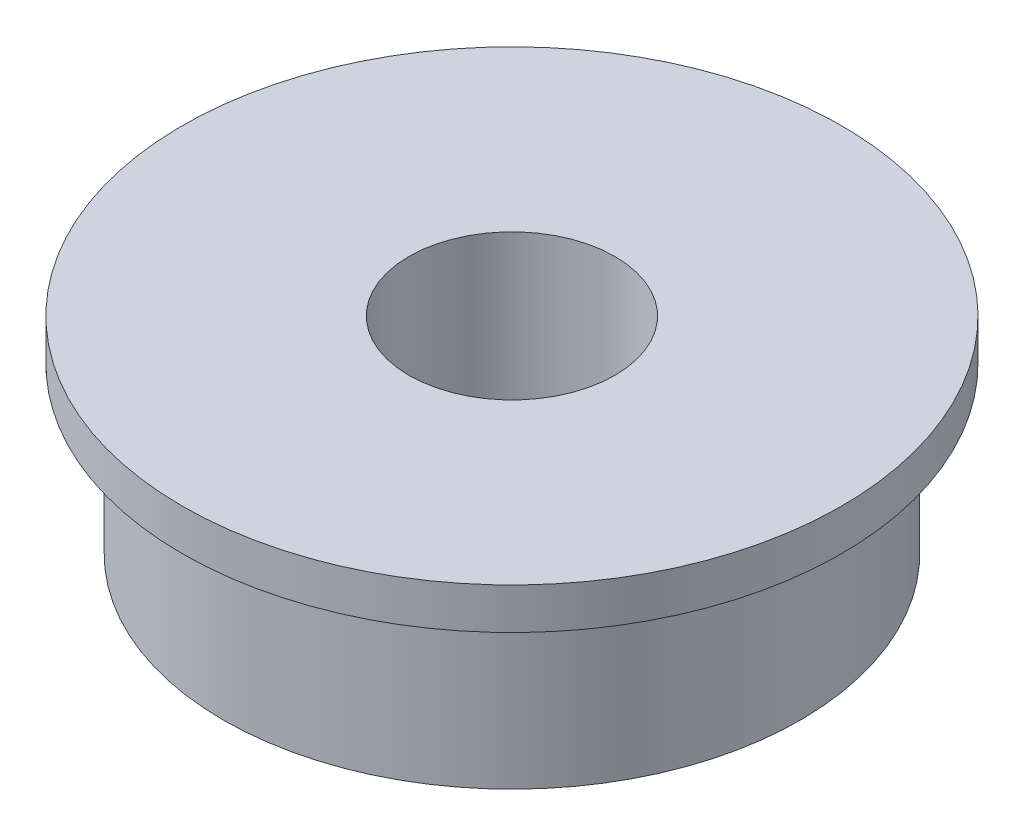
ISO-10303-21;
HEADER;
FILE_DESCRIPTION(('STEP AP214'),'2;1');
FILE_NAME('part.step','',(''),(''),'','','');
FILE_SCHEMA(('AUTOMOTIVE_DESIGN { 1 0 10303 214 1 1 1 1 }'));
ENDSEC;
DATA;
#1=APPLICATION_CONTEXT('core data for automotive mechanical design processes');
#2=APPLICATION_PROTOCOL_DEFINITION('international standard','automotive_design',2000,#1);
#3=PRODUCT_CONTEXT('',#1,'mechanical');
#4=PRODUCT('Part','Part','',(#3));
#5=PRODUCT_RELATED_PRODUCT_CATEGORY('part','',(#4));
#6=PRODUCT_DEFINITION_FORMATION('','',#4);
#7=PRODUCT_DEFINITION_CONTEXT('part definition',#1,'design');
#8=PRODUCT_DEFINITION('design','',#6,#7);
#9=PRODUCT_DEFINITION_SHAPE('','',#8);
#10=(LENGTH_UNIT() NAMED_UNIT(*) SI_UNIT(.MILLI.,.METRE.));
#11=(NAMED_UNIT(*) PLANE_ANGLE_UNIT() SI_UNIT($,.RADIAN.));
#12=(NAMED_UNIT(*) SI_UNIT($,.STERADIAN.) SOLID_ANGLE_UNIT());
#13=UNCERTAINTY_MEASURE_WITH_UNIT(LENGTH_MEASURE(1.E-05),#10,'distance_accuracy_value','');
#14=(GEOMETRIC_REPRESENTATION_CONTEXT(3) GLOBAL_UNCERTAINTY_ASSIGNED_CONTEXT((#13)) GLOBAL_UNIT_ASSIGNED_CONTEXT((#10,
#11,#12)) REPRESENTATION_CONTEXT('',''));
#15=CARTESIAN_POINT('',(0.,0.,0.));
#16=DIRECTION('',(0.,0.,1.));
#17=DIRECTION('',(1.,0.,0.));
#18=AXIS2_PLACEMENT_3D('',#15,#16,#17);
#19=CARTESIAN_POINT('',(0.,5.,0.));
#20=DIRECTION('',(0.,-1.,0.));
#21=DIRECTION('',(0.,0.,-1.));
#22=AXIS2_PLACEMENT_3D('',#19,#20,#21);
#23=CYLINDRICAL_SURFACE('',#22,7.);
#24=CARTESIAN_POINT('',(0.,0.,0.));
#25=DIRECTION('',(0.,1.,0.));
#26=DIRECTION('',(0.,0.,1.));
#27=AXIS2_PLACEMENT_3D('',#24,#25,#26);
#28=CIRCLE('',#27,7.);
#29=CARTESIAN_POINT('',(0.,0.,7.));
#30=VERTEX_POINT('',#29);
#31=EDGE_CURVE('E40',#30,#30,#28,.T.);
#32=ORIENTED_EDGE('',*,*,#31,.T.);
#33=EDGE_LOOP('',(#32));
#34=FACE_BOUND('',#33,.T.);
#35=CARTESIAN_POINT('',(0.,4.,0.));
#36=DIRECTION('',(0.,1.,0.));
#37=DIRECTION('',(0.,0.,1.));
#38=AXIS2_PLACEMENT_3D('',#35,#36,#37);
#39=CIRCLE('',#38,7.);
#40=CARTESIAN_POINT('',(0.,4.,7.));
#41=VERTEX_POINT('',#40);
#42=EDGE_CURVE('E10',#41,#41,#39,.T.);
#43=ORIENTED_EDGE('',*,*,#42,.F.);
#44=EDGE_LOOP('',(#43));
#45=FACE_BOUND('',#44,.T.);
#46=ADVANCED_FACE('F34',(#34,#45),#23,.T.);
#47=CARTESIAN_POINT('',(0.,5.,0.));
#48=DIRECTION('',(0.,1.,0.));
#49=DIRECTION('',(0.,0.,1.));
#50=AXIS2_PLACEMENT_3D('',#47,#48,#49);
#51=PLANE('',#50);
#52=CARTESIAN_POINT('',(0.,5.,0.));
#53=DIRECTION('',(0.,1.,0.));
#54=DIRECTION('',(0.,0.,1.));
#55=AXIS2_PLACEMENT_3D('',#52,#53,#54);
#56=CIRCLE('',#55,8.);
#57=CARTESIAN_POINT('',(0.,5.,8.));
#58=VERTEX_POINT('',#57);
#59=EDGE_CURVE('E54',#58,#58,#56,.T.);
#60=ORIENTED_EDGE('',*,*,#59,.T.);
#61=EDGE_LOOP('',(#60));
#62=FACE_BOUND('',#61,.T.);
#63=CARTESIAN_POINT('',(0.,5.,0.));
#64=DIRECTION('',(0.,1.,0.));
#65=DIRECTION('',(0.,0.,1.));
#66=AXIS2_PLACEMENT_3D('',#63,#64,#65);
#67=CIRCLE('',#66,2.5);
#68=CARTESIAN_POINT('',(0.,5.,2.5));
#69=VERTEX_POINT('',#68);
#70=EDGE_CURVE('E44',#69,#69,#67,.T.);
#71=ORIENTED_EDGE('',*,*,#70,.F.);
#72=EDGE_LOOP('',(#71));
#73=FACE_BOUND('',#72,.T.);
#74=ADVANCED_FACE('F76',(#62,#73),#51,.T.);
#75=CARTESIAN_POINT('',(0.,0.,0.));
#76=DIRECTION('',(0.,1.,0.));
#77=DIRECTION('',(0.,0.,1.));
#78=AXIS2_PLACEMENT_3D('',#75,#76,#77);
#79=PLANE('',#78);
#80=ORIENTED_EDGE('',*,*,#31,.F.);
#81=EDGE_LOOP('',(#80));
#82=FACE_BOUND('',#81,.T.);
#83=CARTESIAN_POINT('',(0.,0.,0.));
#84=DIRECTION('',(0.,1.,0.));
#85=DIRECTION('',(0.,0.,1.));
#86=AXIS2_PLACEMENT_3D('',#83,#84,#85);
#87=CIRCLE('',#86,2.5);
#88=CARTESIAN_POINT('',(0.,0.,2.5));
#89=VERTEX_POINT('',#88);
#90=EDGE_CURVE('E48',#89,#89,#87,.T.);
#91=ORIENTED_EDGE('',*,*,#90,.T.);
#92=EDGE_LOOP('',(#91));
#93=FACE_BOUND('',#92,.T.);
#94=ADVANCED_FACE('F72',(#82,#93),#79,.F.);
#95=CARTESIAN_POINT('',(0.,5.,0.));
#96=DIRECTION('',(0.,-1.,0.));
#97=DIRECTION('',(0.,0.,-1.));
#98=AXIS2_PLACEMENT_3D('',#95,#96,#97);
#99=CYLINDRICAL_SURFACE('',#98,2.5);
#100=ORIENTED_EDGE('',*,*,#70,.T.);
#101=EDGE_LOOP('',(#100));
#102=FACE_BOUND('',#101,.T.);
#103=ORIENTED_EDGE('',*,*,#90,.F.);
#104=EDGE_LOOP('',(#103));
#105=FACE_BOUND('',#104,.T.);
#106=ADVANCED_FACE('F65',(#102,#105),#99,.F.);
#107=CARTESIAN_POINT('',(0.,4.,0.));
#108=DIRECTION('',(0.,1.,0.));
#109=DIRECTION('',(0.,0.,1.));
#110=AXIS2_PLACEMENT_3D('',#107,#108,#109);
#111=PLANE('',#110);
#112=CARTESIAN_POINT('',(0.,4.,0.));
#113=DIRECTION('',(0.,1.,0.));
#114=DIRECTION('',(0.,0.,1.));
#115=AXIS2_PLACEMENT_3D('',#112,#113,#114);
#116=CIRCLE('',#115,8.);
#117=CARTESIAN_POINT('',(0.,4.,8.));
#118=VERTEX_POINT('',#117);
#119=EDGE_CURVE('E52',#118,#118,#116,.T.);
#120=ORIENTED_EDGE('',*,*,#119,.F.);
#121=EDGE_LOOP('',(#120));
#122=FACE_BOUND('',#121,.T.);
#123=ORIENTED_EDGE('',*,*,#42,.T.);
#124=EDGE_LOOP('',(#123));
#125=FACE_BOUND('',#124,.T.);
#126=ADVANCED_FACE('F63',(#122,#125),#111,.F.);
#127=CARTESIAN_POINT('',(0.,4.,0.));
#128=DIRECTION('',(0.,1.,0.));
#129=DIRECTION('',(0.,0.,1.));
#130=AXIS2_PLACEMENT_3D('',#127,#128,#129);
#131=CYLINDRICAL_SURFACE('',#130,8.);
#132=ORIENTED_EDGE('',*,*,#119,.T.);
#133=EDGE_LOOP('',(#132));
#134=FACE_BOUND('',#133,.T.);
#135=ORIENTED_EDGE('',*,*,#59,.F.);
#136=EDGE_LOOP('',(#135));
#137=FACE_BOUND('',#136,.T.);
#138=ADVANCED_FACE('F60',(#134,#137),#131,.T.);
#139=CLOSED_SHELL('',(#46,#74,#94,#106,#126,#138));
#140=MANIFOLD_SOLID_BREP('B2',#139);
#141=ADVANCED_BREP_SHAPE_REPRESENTATION('',(#18,#140),#14);
#142=SHAPE_DEFINITION_REPRESENTATION(#9,#141);
ENDSEC;
END-ISO-10303-21;
